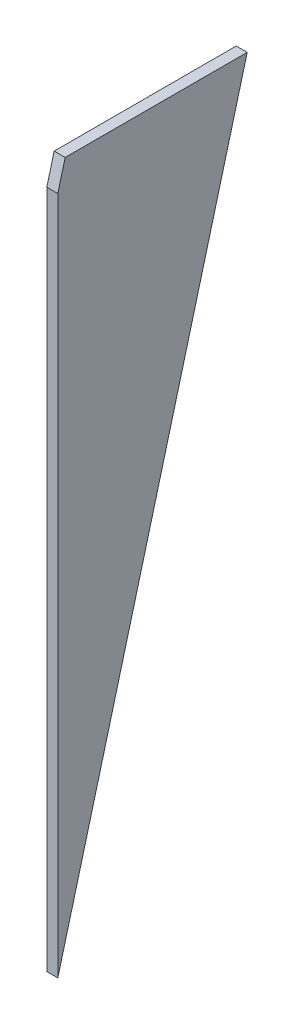
ISO-10303-21;
HEADER;
FILE_DESCRIPTION(('STEP AP214'),'2;1');
FILE_NAME('part.step','',(''),(''),'','','');
FILE_SCHEMA(('AUTOMOTIVE_DESIGN { 1 0 10303 214 1 1 1 1 }'));
ENDSEC;
DATA;
#1=APPLICATION_CONTEXT('core data for automotive mechanical design processes');
#2=APPLICATION_PROTOCOL_DEFINITION('international standard','automotive_design',2000,#1);
#3=PRODUCT_CONTEXT('',#1,'mechanical');
#4=PRODUCT('Part','Part','',(#3));
#5=PRODUCT_RELATED_PRODUCT_CATEGORY('part','',(#4));
#6=PRODUCT_DEFINITION_FORMATION('','',#4);
#7=PRODUCT_DEFINITION_CONTEXT('part definition',#1,'design');
#8=PRODUCT_DEFINITION('design','',#6,#7);
#9=PRODUCT_DEFINITION_SHAPE('','',#8);
#10=(LENGTH_UNIT() NAMED_UNIT(*) SI_UNIT(.MILLI.,.METRE.));
#11=(NAMED_UNIT(*) PLANE_ANGLE_UNIT() SI_UNIT($,.RADIAN.));
#12=(NAMED_UNIT(*) SI_UNIT($,.STERADIAN.) SOLID_ANGLE_UNIT());
#13=UNCERTAINTY_MEASURE_WITH_UNIT(LENGTH_MEASURE(1.E-05),#10,'distance_accuracy_value','');
#14=(GEOMETRIC_REPRESENTATION_CONTEXT(3) GLOBAL_UNCERTAINTY_ASSIGNED_CONTEXT((#13)) GLOBAL_UNIT_ASSIGNED_CONTEXT((#10,
#11,#12)) REPRESENTATION_CONTEXT('',''));
#15=CARTESIAN_POINT('',(0.,0.,0.));
#16=DIRECTION('',(0.,0.,1.));
#17=DIRECTION('',(1.,0.,0.));
#18=AXIS2_PLACEMENT_3D('',#15,#16,#17);
#19=CARTESIAN_POINT('',(0.,0.,0.));
#20=DIRECTION('',(1.,0.,0.));
#21=DIRECTION('',(0.,0.,-1.));
#22=AXIS2_PLACEMENT_3D('',#19,#20,#21);
#23=PLANE('',#22);
#24=DIRECTION('',(0.,0.,1.));
#25=VECTOR('',#24,1.);
#26=CARTESIAN_POINT('',(0.,0.,-54.7263181910106));
#27=LINE('',#26,#25);
#28=CARTESIAN_POINT('',(0.,1.87708737442451E-12,-54.7263181910072));
#29=VERTEX_POINT('',#28);
#30=CARTESIAN_POINT('',(0.,6.31657417687148E-13,-2.13428822617032));
#31=VERTEX_POINT('',#30);
#32=EDGE_CURVE('E78',#29,#31,#27,.T.);
#33=ORIENTED_EDGE('',*,*,#32,.F.);
#34=DIRECTION('',(0.,0.965925826289076,-0.258819045102493));
#35=VECTOR('',#34,1.);
#36=CARTESIAN_POINT('',(0.,-204.2414,0.));
#37=LINE('',#36,#35);
#38=CARTESIAN_POINT('',(0.,-204.2414,0.));
#39=VERTEX_POINT('',#38);
#40=EDGE_CURVE('E54',#39,#29,#37,.T.);
#41=ORIENTED_EDGE('',*,*,#40,.F.);
#42=DIRECTION('',(0.,1.,0.));
#43=VECTOR('',#42,1.);
#44=CARTESIAN_POINT('',(0.,-7.9652720980625,0.));
#45=LINE('',#44,#43);
#46=CARTESIAN_POINT('',(0.,-7.96527209806253,0.));
#47=VERTEX_POINT('',#46);
#48=EDGE_CURVE('E56',#47,#39,#45,.F.);
#49=ORIENTED_EDGE('',*,*,#48,.F.);
#50=DIRECTION('',(0.,-0.965925826289076,0.258819045102493));
#51=VECTOR('',#50,1.);
#52=CARTESIAN_POINT('',(0.,0.,-2.13428822617015));
#53=LINE('',#52,#51);
#54=EDGE_CURVE('E19',#31,#47,#53,.T.);
#55=ORIENTED_EDGE('',*,*,#54,.F.);
#56=EDGE_LOOP('',(#33,#41,#49,#55));
#57=FACE_BOUND('',#56,.T.);
#58=ADVANCED_FACE('F16',(#57),#23,.F.);
#59=CARTESIAN_POINT('',(0.,0.,-2.13428822617015));
#60=DIRECTION('',(0.,0.258819045102493,0.965925826289076));
#61=DIRECTION('',(0.,-0.965925826289076,0.258819045102493));
#62=AXIS2_PLACEMENT_3D('',#59,#60,#61);
#63=PLANE('',#62);
#64=DIRECTION('',(0.,-0.965925826289064,0.258819045102538));
#65=VECTOR('',#64,1.);
#66=CARTESIAN_POINT('',(3.175,0.,-2.13428822617015));
#67=LINE('',#66,#65);
#68=CARTESIAN_POINT('',(3.175,3.15832622242125E-13,-2.13428822617024));
#69=VERTEX_POINT('',#68);
#70=CARTESIAN_POINT('',(3.175,-7.96527209806255,-1.85778042255391E-13));
#71=VERTEX_POINT('',#70);
#72=EDGE_CURVE('E82',#69,#71,#67,.T.);
#73=ORIENTED_EDGE('',*,*,#72,.F.);
#74=DIRECTION('',(1.,0.,0.));
#75=VECTOR('',#74,1.);
#76=CARTESIAN_POINT('',(0.,0.,-2.13428822617016));
#77=LINE('',#76,#75);
#78=EDGE_CURVE('E67',#31,#69,#77,.T.);
#79=ORIENTED_EDGE('',*,*,#78,.F.);
#80=ORIENTED_EDGE('',*,*,#54,.T.);
#81=DIRECTION('',(1.,0.,0.));
#82=VECTOR('',#81,1.);
#83=CARTESIAN_POINT('',(0.,-7.9652720980625,0.));
#84=LINE('',#83,#82);
#85=EDGE_CURVE('E62',#71,#47,#84,.F.);
#86=ORIENTED_EDGE('',*,*,#85,.F.);
#87=EDGE_LOOP('',(#73,#79,#80,#86));
#88=FACE_BOUND('',#87,.T.);
#89=ADVANCED_FACE('F64',(#88),#63,.T.);
#90=CARTESIAN_POINT('',(0.,-7.9652720980625,0.));
#91=DIRECTION('',(0.,0.,1.));
#92=DIRECTION('',(1.,0.,0.));
#93=AXIS2_PLACEMENT_3D('',#90,#91,#92);
#94=PLANE('',#93);
#95=DIRECTION('',(0.,1.,0.));
#96=VECTOR('',#95,1.);
#97=CARTESIAN_POINT('',(3.175,0.,0.));
#98=LINE('',#97,#96);
#99=CARTESIAN_POINT('',(3.175,-204.2414,0.));
#100=VERTEX_POINT('',#99);
#101=EDGE_CURVE('E71',#71,#100,#98,.F.);
#102=ORIENTED_EDGE('',*,*,#101,.F.);
#103=ORIENTED_EDGE('',*,*,#85,.T.);
#104=ORIENTED_EDGE('',*,*,#48,.T.);
#105=DIRECTION('',(1.,0.,0.));
#106=VECTOR('',#105,1.);
#107=CARTESIAN_POINT('',(0.,-204.2414,0.));
#108=LINE('',#107,#106);
#109=EDGE_CURVE('E74',#100,#39,#108,.F.);
#110=ORIENTED_EDGE('',*,*,#109,.F.);
#111=EDGE_LOOP('',(#102,#103,#104,#110));
#112=FACE_BOUND('',#111,.T.);
#113=ADVANCED_FACE('F69',(#112),#94,.T.);
#114=CARTESIAN_POINT('',(0.,-204.2414,0.));
#115=DIRECTION('',(0.,-0.258819045102493,-0.965925826289076));
#116=DIRECTION('',(0.,0.965925826289076,-0.258819045102493));
#117=AXIS2_PLACEMENT_3D('',#114,#115,#116);
#118=PLANE('',#117);
#119=DIRECTION('',(0.,0.965925826289059,-0.258819045102558));
#120=VECTOR('',#119,1.);
#121=CARTESIAN_POINT('',(3.175,-204.2414,0.));
#122=LINE('',#121,#120);
#123=CARTESIAN_POINT('',(3.175,2.80163670041135E-12,-54.7263181910038));
#124=VERTEX_POINT('',#123);
#125=EDGE_CURVE('E25',#100,#124,#122,.T.);
#126=ORIENTED_EDGE('',*,*,#125,.F.);
#127=ORIENTED_EDGE('',*,*,#109,.T.);
#128=ORIENTED_EDGE('',*,*,#40,.T.);
#129=DIRECTION('',(1.,0.,0.));
#130=VECTOR('',#129,1.);
#131=CARTESIAN_POINT('',(0.,0.,-54.7263181910106));
#132=LINE('',#131,#130);
#133=EDGE_CURVE('E34',#124,#29,#132,.F.);
#134=ORIENTED_EDGE('',*,*,#133,.F.);
#135=EDGE_LOOP('',(#126,#127,#128,#134));
#136=FACE_BOUND('',#135,.T.);
#137=ADVANCED_FACE('F88',(#136),#118,.T.);
#138=CARTESIAN_POINT('',(0.,0.,-54.7263181910106));
#139=DIRECTION('',(0.,1.,0.));
#140=DIRECTION('',(0.,0.,1.));
#141=AXIS2_PLACEMENT_3D('',#138,#139,#140);
#142=PLANE('',#141);
#143=DIRECTION('',(0.,0.,-1.));
#144=VECTOR('',#143,1.);
#145=CARTESIAN_POINT('',(3.175,1.26334498418153E-12,0.));
#146=LINE('',#145,#144);
#147=EDGE_CURVE('E11',#124,#69,#146,.F.);
#148=ORIENTED_EDGE('',*,*,#147,.F.);
#149=ORIENTED_EDGE('',*,*,#133,.T.);
#150=ORIENTED_EDGE('',*,*,#32,.T.);
#151=ORIENTED_EDGE('',*,*,#78,.T.);
#152=EDGE_LOOP('',(#148,#149,#150,#151));
#153=FACE_BOUND('',#152,.T.);
#154=ADVANCED_FACE('F90',(#153),#142,.T.);
#155=CARTESIAN_POINT('',(3.175,0.,0.));
#156=DIRECTION('',(1.,0.,0.));
#157=DIRECTION('',(0.,0.,-1.));
#158=AXIS2_PLACEMENT_3D('',#155,#156,#157);
#159=PLANE('',#158);
#160=ORIENTED_EDGE('',*,*,#125,.T.);
#161=ORIENTED_EDGE('',*,*,#147,.T.);
#162=ORIENTED_EDGE('',*,*,#72,.T.);
#163=ORIENTED_EDGE('',*,*,#101,.T.);
#164=EDGE_LOOP('',(#160,#161,#162,#163));
#165=FACE_BOUND('',#164,.T.);
#166=ADVANCED_FACE('F87',(#165),#159,.T.);
#167=CLOSED_SHELL('',(#58,#89,#113,#137,#154,#166));
#168=MANIFOLD_SOLID_BREP('B1',#167);
#169=ADVANCED_BREP_SHAPE_REPRESENTATION('',(#18,#168),#14);
#170=SHAPE_DEFINITION_REPRESENTATION(#9,#169);
ENDSEC;
END-ISO-10303-21;
